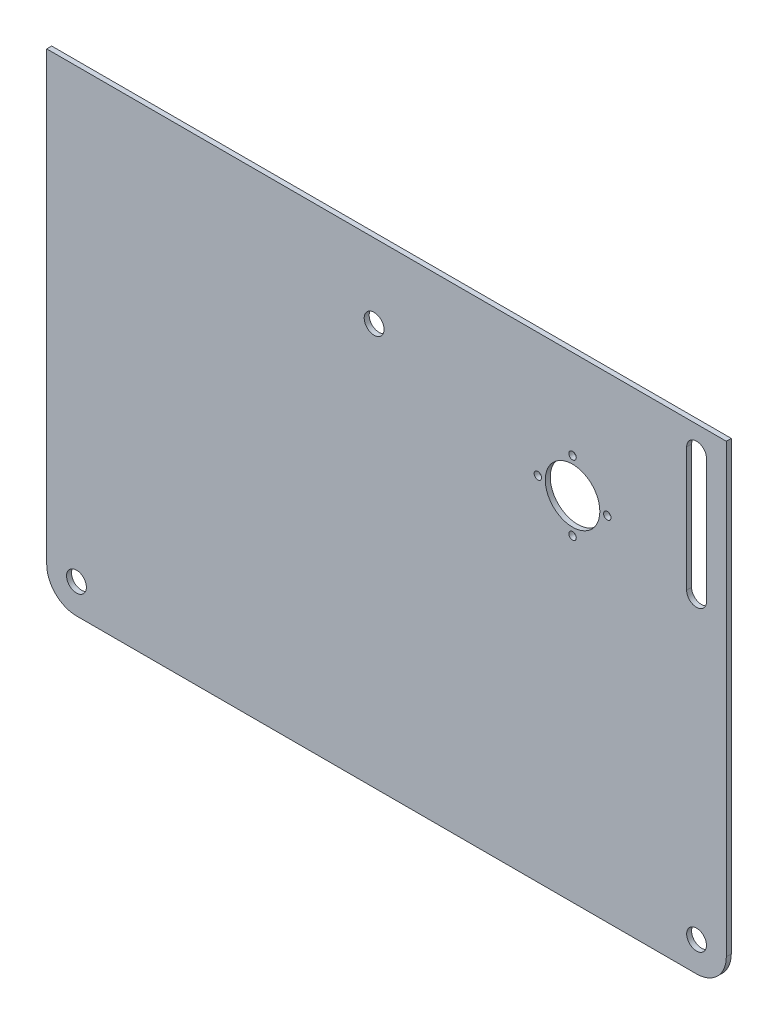
ISO-10303-21;
HEADER;
FILE_DESCRIPTION(('STEP AP214'),'2;1');
FILE_NAME('part.step','',(''),(''),'','','');
FILE_SCHEMA(('AUTOMOTIVE_DESIGN { 1 0 10303 214 1 1 1 1 }'));
ENDSEC;
DATA;
#1=APPLICATION_CONTEXT('core data for automotive mechanical design processes');
#2=APPLICATION_PROTOCOL_DEFINITION('international standard','automotive_design',2000,#1);
#3=PRODUCT_CONTEXT('',#1,'mechanical');
#4=PRODUCT('Part','Part','',(#3));
#5=PRODUCT_RELATED_PRODUCT_CATEGORY('part','',(#4));
#6=PRODUCT_DEFINITION_FORMATION('','',#4);
#7=PRODUCT_DEFINITION_CONTEXT('part definition',#1,'design');
#8=PRODUCT_DEFINITION('design','',#6,#7);
#9=PRODUCT_DEFINITION_SHAPE('','',#8);
#10=(LENGTH_UNIT() NAMED_UNIT(*) SI_UNIT(.MILLI.,.METRE.));
#11=(NAMED_UNIT(*) PLANE_ANGLE_UNIT() SI_UNIT($,.RADIAN.));
#12=(NAMED_UNIT(*) SI_UNIT($,.STERADIAN.) SOLID_ANGLE_UNIT());
#13=UNCERTAINTY_MEASURE_WITH_UNIT(LENGTH_MEASURE(1.E-05),#10,'distance_accuracy_value','');
#14=(GEOMETRIC_REPRESENTATION_CONTEXT(3) GLOBAL_UNCERTAINTY_ASSIGNED_CONTEXT((#13)) GLOBAL_UNIT_ASSIGNED_CONTEXT((#10,
#11,#12)) REPRESENTATION_CONTEXT('',''));
#15=CARTESIAN_POINT('',(0.,0.,0.));
#16=DIRECTION('',(0.,0.,1.));
#17=DIRECTION('',(1.,0.,0.));
#18=AXIS2_PLACEMENT_3D('',#15,#16,#17);
#19=CARTESIAN_POINT('',(0.,-12.,2.));
#20=DIRECTION('',(0.,1.,0.));
#21=DIRECTION('',(0.,0.,1.));
#22=AXIS2_PLACEMENT_3D('',#19,#20,#21);
#23=PLANE('',#22);
#24=DIRECTION('',(1.,0.,0.));
#25=VECTOR('',#24,1.);
#26=CARTESIAN_POINT('',(0.,-12.,0.));
#27=LINE('',#26,#25);
#28=CARTESIAN_POINT('',(-125.,-12.,0.));
#29=VERTEX_POINT('',#28);
#30=CARTESIAN_POINT('',(125.,-12.,0.));
#31=VERTEX_POINT('',#30);
#32=EDGE_CURVE('E212',#29,#31,#27,.T.);
#33=ORIENTED_EDGE('',*,*,#32,.T.);
#34=DIRECTION('',(0.,0.,-1.));
#35=VECTOR('',#34,1.);
#36=CARTESIAN_POINT('',(125.,-12.,2.));
#37=LINE('',#36,#35);
#38=CARTESIAN_POINT('',(125.,-12.,2.));
#39=VERTEX_POINT('',#38);
#40=EDGE_CURVE('E11',#39,#31,#37,.T.);
#41=ORIENTED_EDGE('',*,*,#40,.F.);
#42=DIRECTION('',(1.,0.,0.));
#43=VECTOR('',#42,1.);
#44=CARTESIAN_POINT('',(0.,-12.,2.));
#45=LINE('',#44,#43);
#46=CARTESIAN_POINT('',(-125.,-12.,2.));
#47=VERTEX_POINT('',#46);
#48=EDGE_CURVE('E349',#47,#39,#45,.T.);
#49=ORIENTED_EDGE('',*,*,#48,.F.);
#50=DIRECTION('',(0.,0.,-1.));
#51=VECTOR('',#50,1.);
#52=CARTESIAN_POINT('',(-125.,-12.,2.));
#53=LINE('',#52,#51);
#54=EDGE_CURVE('E65',#47,#29,#53,.T.);
#55=ORIENTED_EDGE('',*,*,#54,.T.);
#56=EDGE_LOOP('',(#33,#41,#49,#55));
#57=FACE_BOUND('',#56,.T.);
#58=ADVANCED_FACE('F45',(#57),#23,.F.);
#59=CARTESIAN_POINT('',(125.,0.,2.));
#60=DIRECTION('',(0.,0.,-1.));
#61=DIRECTION('',(-1.,0.,0.));
#62=AXIS2_PLACEMENT_3D('',#59,#60,#61);
#63=CYLINDRICAL_SURFACE('',#62,12.0000000000001);
#64=CARTESIAN_POINT('',(125.,0.,0.));
#65=DIRECTION('',(0.,0.,1.));
#66=DIRECTION('',(1.,0.,0.));
#67=AXIS2_PLACEMENT_3D('',#64,#65,#66);
#68=CIRCLE('',#67,12.0000000000001);
#69=CARTESIAN_POINT('',(137.,0.,0.));
#70=VERTEX_POINT('',#69);
#71=EDGE_CURVE('E215',#31,#70,#68,.T.);
#72=ORIENTED_EDGE('',*,*,#71,.T.);
#73=DIRECTION('',(0.,0.,-1.));
#74=VECTOR('',#73,1.);
#75=CARTESIAN_POINT('',(137.,0.,2.));
#76=LINE('',#75,#74);
#77=CARTESIAN_POINT('',(137.,0.,2.));
#78=VERTEX_POINT('',#77);
#79=EDGE_CURVE('E56',#78,#70,#76,.T.);
#80=ORIENTED_EDGE('',*,*,#79,.F.);
#81=CARTESIAN_POINT('',(125.,0.,2.));
#82=DIRECTION('',(0.,0.,1.));
#83=DIRECTION('',(1.,0.,0.));
#84=AXIS2_PLACEMENT_3D('',#81,#82,#83);
#85=CIRCLE('',#84,12.0000000000001);
#86=EDGE_CURVE('E352',#39,#78,#85,.T.);
#87=ORIENTED_EDGE('',*,*,#86,.F.);
#88=ORIENTED_EDGE('',*,*,#40,.T.);
#89=EDGE_LOOP('',(#72,#80,#87,#88));
#90=FACE_BOUND('',#89,.T.);
#91=ADVANCED_FACE('F279',(#90),#63,.T.);
#92=CARTESIAN_POINT('',(137.,0.,2.));
#93=DIRECTION('',(-1.,0.,0.));
#94=DIRECTION('',(0.,0.,1.));
#95=AXIS2_PLACEMENT_3D('',#92,#93,#94);
#96=PLANE('',#95);
#97=DIRECTION('',(0.,1.,0.));
#98=VECTOR('',#97,1.);
#99=CARTESIAN_POINT('',(137.,0.,0.));
#100=LINE('',#99,#98);
#101=CARTESIAN_POINT('',(137.,180.,0.));
#102=VERTEX_POINT('',#101);
#103=EDGE_CURVE('E218',#70,#102,#100,.T.);
#104=ORIENTED_EDGE('',*,*,#103,.T.);
#105=DIRECTION('',(0.,0.,-1.));
#106=VECTOR('',#105,1.);
#107=CARTESIAN_POINT('',(137.,180.,2.));
#108=LINE('',#107,#106);
#109=CARTESIAN_POINT('',(137.,180.,2.));
#110=VERTEX_POINT('',#109);
#111=EDGE_CURVE('E153',#110,#102,#108,.T.);
#112=ORIENTED_EDGE('',*,*,#111,.F.);
#113=DIRECTION('',(0.,1.,0.));
#114=VECTOR('',#113,1.);
#115=CARTESIAN_POINT('',(137.,0.,2.));
#116=LINE('',#115,#114);
#117=EDGE_CURVE('E139',#78,#110,#116,.T.);
#118=ORIENTED_EDGE('',*,*,#117,.F.);
#119=ORIENTED_EDGE('',*,*,#79,.T.);
#120=EDGE_LOOP('',(#104,#112,#118,#119));
#121=FACE_BOUND('',#120,.T.);
#122=ADVANCED_FACE('F284',(#121),#96,.F.);
#123=CARTESIAN_POINT('',(0.,180.,2.));
#124=DIRECTION('',(0.,-1.,0.));
#125=DIRECTION('',(1.,0.,0.));
#126=AXIS2_PLACEMENT_3D('',#123,#124,#125);
#127=PLANE('',#126);
#128=DIRECTION('',(-1.,0.,0.));
#129=VECTOR('',#128,1.);
#130=CARTESIAN_POINT('',(0.,180.,0.));
#131=LINE('',#130,#129);
#132=CARTESIAN_POINT('',(-137.,180.,0.));
#133=VERTEX_POINT('',#132);
#134=EDGE_CURVE('E149',#102,#133,#131,.T.);
#135=ORIENTED_EDGE('',*,*,#134,.T.);
#136=DIRECTION('',(0.,0.,-1.));
#137=VECTOR('',#136,1.);
#138=CARTESIAN_POINT('',(-137.,180.,2.));
#139=LINE('',#138,#137);
#140=CARTESIAN_POINT('',(-137.,180.,2.));
#141=VERTEX_POINT('',#140);
#142=EDGE_CURVE('E146',#141,#133,#139,.T.);
#143=ORIENTED_EDGE('',*,*,#142,.F.);
#144=DIRECTION('',(-1.,0.,0.));
#145=VECTOR('',#144,1.);
#146=CARTESIAN_POINT('',(0.,180.,2.));
#147=LINE('',#146,#145);
#148=EDGE_CURVE('E131',#110,#141,#147,.T.);
#149=ORIENTED_EDGE('',*,*,#148,.F.);
#150=ORIENTED_EDGE('',*,*,#111,.T.);
#151=EDGE_LOOP('',(#135,#143,#149,#150));
#152=FACE_BOUND('',#151,.T.);
#153=ADVANCED_FACE('F147',(#152),#127,.F.);
#154=CARTESIAN_POINT('',(-137.,0.,2.));
#155=DIRECTION('',(1.,0.,0.));
#156=DIRECTION('',(0.,1.,0.));
#157=AXIS2_PLACEMENT_3D('',#154,#155,#156);
#158=PLANE('',#157);
#159=DIRECTION('',(0.,-1.,0.));
#160=VECTOR('',#159,1.);
#161=CARTESIAN_POINT('',(-137.,0.,0.));
#162=LINE('',#161,#160);
#163=CARTESIAN_POINT('',(-137.,0.,0.));
#164=VERTEX_POINT('',#163);
#165=EDGE_CURVE('E223',#133,#164,#162,.T.);
#166=ORIENTED_EDGE('',*,*,#165,.T.);
#167=DIRECTION('',(0.,0.,-1.));
#168=VECTOR('',#167,1.);
#169=CARTESIAN_POINT('',(-137.,0.,2.));
#170=LINE('',#169,#168);
#171=CARTESIAN_POINT('',(-137.,0.,2.));
#172=VERTEX_POINT('',#171);
#173=EDGE_CURVE('E98',#172,#164,#170,.T.);
#174=ORIENTED_EDGE('',*,*,#173,.F.);
#175=DIRECTION('',(0.,-1.,0.));
#176=VECTOR('',#175,1.);
#177=CARTESIAN_POINT('',(-137.,0.,2.));
#178=LINE('',#177,#176);
#179=EDGE_CURVE('E137',#141,#172,#178,.T.);
#180=ORIENTED_EDGE('',*,*,#179,.F.);
#181=ORIENTED_EDGE('',*,*,#142,.T.);
#182=EDGE_LOOP('',(#166,#174,#180,#181));
#183=FACE_BOUND('',#182,.T.);
#184=ADVANCED_FACE('F155',(#183),#158,.F.);
#185=CARTESIAN_POINT('',(125.,120.,2.));
#186=DIRECTION('',(0.,0.,-1.));
#187=DIRECTION('',(-1.,0.,0.));
#188=AXIS2_PLACEMENT_3D('',#185,#186,#187);
#189=CYLINDRICAL_SURFACE('',#188,3.99999999999999);
#190=CARTESIAN_POINT('',(125.,120.,0.));
#191=DIRECTION('',(0.,0.,1.));
#192=DIRECTION('',(1.,0.,0.));
#193=AXIS2_PLACEMENT_3D('',#190,#191,#192);
#194=CIRCLE('',#193,3.99999999999999);
#195=CARTESIAN_POINT('',(121.,120.,0.));
#196=VERTEX_POINT('',#195);
#197=CARTESIAN_POINT('',(129.,120.,0.));
#198=VERTEX_POINT('',#197);
#199=EDGE_CURVE('E196',#196,#198,#194,.T.);
#200=ORIENTED_EDGE('',*,*,#199,.F.);
#201=DIRECTION('',(0.,0.,-1.));
#202=VECTOR('',#201,1.);
#203=CARTESIAN_POINT('',(121.,120.,2.));
#204=LINE('',#203,#202);
#205=CARTESIAN_POINT('',(121.,120.,2.));
#206=VERTEX_POINT('',#205);
#207=EDGE_CURVE('E49',#206,#196,#204,.T.);
#208=ORIENTED_EDGE('',*,*,#207,.F.);
#209=CARTESIAN_POINT('',(125.,120.,2.));
#210=DIRECTION('',(0.,0.,1.));
#211=DIRECTION('',(1.,0.,0.));
#212=AXIS2_PLACEMENT_3D('',#209,#210,#211);
#213=CIRCLE('',#212,3.99999999999999);
#214=CARTESIAN_POINT('',(129.,120.,2.));
#215=VERTEX_POINT('',#214);
#216=EDGE_CURVE('E261',#206,#215,#213,.T.);
#217=ORIENTED_EDGE('',*,*,#216,.T.);
#218=DIRECTION('',(0.,0.,-1.));
#219=VECTOR('',#218,1.);
#220=CARTESIAN_POINT('',(129.,120.,2.));
#221=LINE('',#220,#219);
#222=EDGE_CURVE('E160',#215,#198,#221,.T.);
#223=ORIENTED_EDGE('',*,*,#222,.T.);
#224=EDGE_LOOP('',(#200,#208,#217,#223));
#225=FACE_BOUND('',#224,.T.);
#226=ADVANCED_FACE('F260',(#225),#189,.F.);
#227=CARTESIAN_POINT('',(121.,0.,2.));
#228=DIRECTION('',(-1.,0.,0.));
#229=DIRECTION('',(0.,0.,1.));
#230=AXIS2_PLACEMENT_3D('',#227,#228,#229);
#231=PLANE('',#230);
#232=DIRECTION('',(0.,1.,0.));
#233=VECTOR('',#232,1.);
#234=CARTESIAN_POINT('',(121.,0.,0.));
#235=LINE('',#234,#233);
#236=CARTESIAN_POINT('',(121.,170.,0.));
#237=VERTEX_POINT('',#236);
#238=EDGE_CURVE('E200',#196,#237,#235,.T.);
#239=ORIENTED_EDGE('',*,*,#238,.T.);
#240=DIRECTION('',(0.,0.,-1.));
#241=VECTOR('',#240,1.);
#242=CARTESIAN_POINT('',(121.,170.,2.));
#243=LINE('',#242,#241);
#244=CARTESIAN_POINT('',(121.,170.,2.));
#245=VERTEX_POINT('',#244);
#246=EDGE_CURVE('E244',#245,#237,#243,.T.);
#247=ORIENTED_EDGE('',*,*,#246,.F.);
#248=DIRECTION('',(0.,1.,0.));
#249=VECTOR('',#248,1.);
#250=CARTESIAN_POINT('',(121.,0.,2.));
#251=LINE('',#250,#249);
#252=EDGE_CURVE('E254',#206,#245,#251,.T.);
#253=ORIENTED_EDGE('',*,*,#252,.F.);
#254=ORIENTED_EDGE('',*,*,#207,.T.);
#255=EDGE_LOOP('',(#239,#247,#253,#254));
#256=FACE_BOUND('',#255,.T.);
#257=ADVANCED_FACE('F253',(#256),#231,.F.);
#258=CARTESIAN_POINT('',(125.,170.,2.));
#259=DIRECTION('',(0.,0.,-1.));
#260=DIRECTION('',(-1.,0.,0.));
#261=AXIS2_PLACEMENT_3D('',#258,#259,#260);
#262=CYLINDRICAL_SURFACE('',#261,3.99999999999995);
#263=CARTESIAN_POINT('',(125.,170.,0.));
#264=DIRECTION('',(0.,0.,1.));
#265=DIRECTION('',(1.,0.,0.));
#266=AXIS2_PLACEMENT_3D('',#263,#264,#265);
#267=CIRCLE('',#266,3.99999999999995);
#268=CARTESIAN_POINT('',(129.,170.,0.));
#269=VERTEX_POINT('',#268);
#270=EDGE_CURVE('E204',#269,#237,#267,.T.);
#271=ORIENTED_EDGE('',*,*,#270,.F.);
#272=DIRECTION('',(0.,0.,-1.));
#273=VECTOR('',#272,1.);
#274=CARTESIAN_POINT('',(129.,170.,2.));
#275=LINE('',#274,#273);
#276=CARTESIAN_POINT('',(129.,170.,2.));
#277=VERTEX_POINT('',#276);
#278=EDGE_CURVE('E242',#277,#269,#275,.T.);
#279=ORIENTED_EDGE('',*,*,#278,.F.);
#280=CARTESIAN_POINT('',(125.,170.,2.));
#281=DIRECTION('',(0.,0.,1.));
#282=DIRECTION('',(1.,0.,0.));
#283=AXIS2_PLACEMENT_3D('',#280,#281,#282);
#284=CIRCLE('',#283,3.99999999999995);
#285=EDGE_CURVE('E340',#277,#245,#284,.T.);
#286=ORIENTED_EDGE('',*,*,#285,.T.);
#287=ORIENTED_EDGE('',*,*,#246,.T.);
#288=EDGE_LOOP('',(#271,#279,#286,#287));
#289=FACE_BOUND('',#288,.T.);
#290=ADVANCED_FACE('F268',(#289),#262,.F.);
#291=CARTESIAN_POINT('',(129.,0.,2.));
#292=DIRECTION('',(-1.,0.,0.));
#293=DIRECTION('',(0.,-1.,0.));
#294=AXIS2_PLACEMENT_3D('',#291,#292,#293);
#295=PLANE('',#294);
#296=DIRECTION('',(0.,1.,0.));
#297=VECTOR('',#296,1.);
#298=CARTESIAN_POINT('',(129.,0.,0.));
#299=LINE('',#298,#297);
#300=EDGE_CURVE('E208',#198,#269,#299,.T.);
#301=ORIENTED_EDGE('',*,*,#300,.F.);
#302=ORIENTED_EDGE('',*,*,#222,.F.);
#303=DIRECTION('',(0.,1.,0.));
#304=VECTOR('',#303,1.);
#305=CARTESIAN_POINT('',(129.,0.,2.));
#306=LINE('',#305,#304);
#307=EDGE_CURVE('E266',#215,#277,#306,.T.);
#308=ORIENTED_EDGE('',*,*,#307,.T.);
#309=ORIENTED_EDGE('',*,*,#278,.T.);
#310=EDGE_LOOP('',(#301,#302,#308,#309));
#311=FACE_BOUND('',#310,.T.);
#312=ADVANCED_FACE('F265',(#311),#295,.T.);
#313=CARTESIAN_POINT('',(-5.00000000000002,150.,2.));
#314=DIRECTION('',(0.,0.,-1.));
#315=DIRECTION('',(-1.,0.,0.));
#316=AXIS2_PLACEMENT_3D('',#313,#314,#315);
#317=CYLINDRICAL_SURFACE('',#316,4.00000000000001);
#318=CARTESIAN_POINT('',(-5.00000000000002,150.,2.));
#319=DIRECTION('',(0.,0.,1.));
#320=DIRECTION('',(1.,0.,0.));
#321=AXIS2_PLACEMENT_3D('',#318,#319,#320);
#322=CIRCLE('',#321,4.00000000000001);
#323=CARTESIAN_POINT('',(-1.00000000000001,150.,2.));
#324=VERTEX_POINT('',#323);
#325=EDGE_CURVE('E335',#324,#324,#322,.T.);
#326=ORIENTED_EDGE('',*,*,#325,.T.);
#327=EDGE_LOOP('',(#326));
#328=FACE_BOUND('',#327,.T.);
#329=CARTESIAN_POINT('',(-5.00000000000002,150.,0.));
#330=DIRECTION('',(0.,0.,1.));
#331=DIRECTION('',(1.,0.,0.));
#332=AXIS2_PLACEMENT_3D('',#329,#330,#331);
#333=CIRCLE('',#332,4.00000000000001);
#334=CARTESIAN_POINT('',(-1.00000000000001,150.,0.));
#335=VERTEX_POINT('',#334);
#336=EDGE_CURVE('E192',#335,#335,#333,.T.);
#337=ORIENTED_EDGE('',*,*,#336,.F.);
#338=EDGE_LOOP('',(#337));
#339=FACE_BOUND('',#338,.T.);
#340=ADVANCED_FACE('F275',(#328,#339),#317,.F.);
#341=CARTESIAN_POINT('',(75.,130.,2.));
#342=DIRECTION('',(0.,0.,-1.));
#343=DIRECTION('',(-1.,0.,0.));
#344=AXIS2_PLACEMENT_3D('',#341,#342,#343);
#345=CYLINDRICAL_SURFACE('',#344,11.);
#346=CARTESIAN_POINT('',(75.,130.,2.));
#347=DIRECTION('',(0.,0.,1.));
#348=DIRECTION('',(1.,0.,0.));
#349=AXIS2_PLACEMENT_3D('',#346,#347,#348);
#350=CIRCLE('',#349,11.);
#351=CARTESIAN_POINT('',(86.,130.,2.));
#352=VERTEX_POINT('',#351);
#353=EDGE_CURVE('E331',#352,#352,#350,.T.);
#354=ORIENTED_EDGE('',*,*,#353,.T.);
#355=EDGE_LOOP('',(#354));
#356=FACE_BOUND('',#355,.T.);
#357=CARTESIAN_POINT('',(75.,130.,0.));
#358=DIRECTION('',(0.,0.,1.));
#359=DIRECTION('',(1.,0.,0.));
#360=AXIS2_PLACEMENT_3D('',#357,#358,#359);
#361=CIRCLE('',#360,11.);
#362=CARTESIAN_POINT('',(86.,130.,0.));
#363=VERTEX_POINT('',#362);
#364=EDGE_CURVE('E188',#363,#363,#361,.T.);
#365=ORIENTED_EDGE('',*,*,#364,.F.);
#366=EDGE_LOOP('',(#365));
#367=FACE_BOUND('',#366,.T.);
#368=ADVANCED_FACE('F392',(#356,#367),#345,.F.);
#369=CARTESIAN_POINT('',(125.,0.,2.));
#370=DIRECTION('',(0.,0.,-1.));
#371=DIRECTION('',(-1.,0.,0.));
#372=AXIS2_PLACEMENT_3D('',#369,#370,#371);
#373=CYLINDRICAL_SURFACE('',#372,3.99999999999999);
#374=CARTESIAN_POINT('',(125.,0.,2.));
#375=DIRECTION('',(0.,0.,1.));
#376=DIRECTION('',(1.,0.,0.));
#377=AXIS2_PLACEMENT_3D('',#374,#375,#376);
#378=CIRCLE('',#377,3.99999999999999);
#379=CARTESIAN_POINT('',(129.,0.,2.));
#380=VERTEX_POINT('',#379);
#381=EDGE_CURVE('E327',#380,#380,#378,.T.);
#382=ORIENTED_EDGE('',*,*,#381,.T.);
#383=EDGE_LOOP('',(#382));
#384=FACE_BOUND('',#383,.T.);
#385=CARTESIAN_POINT('',(125.,0.,0.));
#386=DIRECTION('',(0.,0.,1.));
#387=DIRECTION('',(1.,0.,0.));
#388=AXIS2_PLACEMENT_3D('',#385,#386,#387);
#389=CIRCLE('',#388,3.99999999999999);
#390=CARTESIAN_POINT('',(129.,0.,0.));
#391=VERTEX_POINT('',#390);
#392=EDGE_CURVE('E184',#391,#391,#389,.T.);
#393=ORIENTED_EDGE('',*,*,#392,.F.);
#394=EDGE_LOOP('',(#393));
#395=FACE_BOUND('',#394,.T.);
#396=ADVANCED_FACE('F398',(#384,#395),#373,.F.);
#397=CARTESIAN_POINT('',(-125.,0.,2.));
#398=DIRECTION('',(0.,0.,-1.));
#399=DIRECTION('',(-1.,0.,0.));
#400=AXIS2_PLACEMENT_3D('',#397,#398,#399);
#401=CYLINDRICAL_SURFACE('',#400,4.00000000000001);
#402=CARTESIAN_POINT('',(-125.,0.,2.));
#403=DIRECTION('',(0.,0.,1.));
#404=DIRECTION('',(1.,0.,0.));
#405=AXIS2_PLACEMENT_3D('',#402,#403,#404);
#406=CIRCLE('',#405,4.00000000000001);
#407=CARTESIAN_POINT('',(-121.,0.,2.));
#408=VERTEX_POINT('',#407);
#409=EDGE_CURVE('E323',#408,#408,#406,.T.);
#410=ORIENTED_EDGE('',*,*,#409,.T.);
#411=EDGE_LOOP('',(#410));
#412=FACE_BOUND('',#411,.T.);
#413=CARTESIAN_POINT('',(-125.,0.,0.));
#414=DIRECTION('',(0.,0.,1.));
#415=DIRECTION('',(1.,0.,0.));
#416=AXIS2_PLACEMENT_3D('',#413,#414,#415);
#417=CIRCLE('',#416,4.00000000000001);
#418=CARTESIAN_POINT('',(-121.,0.,0.));
#419=VERTEX_POINT('',#418);
#420=EDGE_CURVE('E180',#419,#419,#417,.T.);
#421=ORIENTED_EDGE('',*,*,#420,.F.);
#422=EDGE_LOOP('',(#421));
#423=FACE_BOUND('',#422,.T.);
#424=ADVANCED_FACE('F405',(#412,#423),#401,.F.);
#425=CARTESIAN_POINT('',(75.,144.,2.));
#426=DIRECTION('',(0.,0.,-1.));
#427=DIRECTION('',(-1.,0.,0.));
#428=AXIS2_PLACEMENT_3D('',#425,#426,#427);
#429=CYLINDRICAL_SURFACE('',#428,1.5);
#430=CARTESIAN_POINT('',(75.,144.,2.));
#431=DIRECTION('',(0.,0.,1.));
#432=DIRECTION('',(1.,0.,0.));
#433=AXIS2_PLACEMENT_3D('',#430,#431,#432);
#434=CIRCLE('',#433,1.5);
#435=CARTESIAN_POINT('',(76.5,144.,2.));
#436=VERTEX_POINT('',#435);
#437=EDGE_CURVE('E319',#436,#436,#434,.T.);
#438=ORIENTED_EDGE('',*,*,#437,.T.);
#439=EDGE_LOOP('',(#438));
#440=FACE_BOUND('',#439,.T.);
#441=CARTESIAN_POINT('',(75.,144.,0.));
#442=DIRECTION('',(0.,0.,1.));
#443=DIRECTION('',(1.,0.,0.));
#444=AXIS2_PLACEMENT_3D('',#441,#442,#443);
#445=CIRCLE('',#444,1.5);
#446=CARTESIAN_POINT('',(76.5,144.,0.));
#447=VERTEX_POINT('',#446);
#448=EDGE_CURVE('E176',#447,#447,#445,.T.);
#449=ORIENTED_EDGE('',*,*,#448,.F.);
#450=EDGE_LOOP('',(#449));
#451=FACE_BOUND('',#450,.T.);
#452=ADVANCED_FACE('F409',(#440,#451),#429,.F.);
#453=CARTESIAN_POINT('',(89.,130.,2.));
#454=DIRECTION('',(0.,0.,-1.));
#455=DIRECTION('',(-1.,0.,0.));
#456=AXIS2_PLACEMENT_3D('',#453,#454,#455);
#457=CYLINDRICAL_SURFACE('',#456,1.49999999999998);
#458=CARTESIAN_POINT('',(89.,130.,2.));
#459=DIRECTION('',(0.,0.,1.));
#460=DIRECTION('',(1.,0.,0.));
#461=AXIS2_PLACEMENT_3D('',#458,#459,#460);
#462=CIRCLE('',#461,1.49999999999998);
#463=CARTESIAN_POINT('',(90.5,130.,2.));
#464=VERTEX_POINT('',#463);
#465=EDGE_CURVE('E315',#464,#464,#462,.T.);
#466=ORIENTED_EDGE('',*,*,#465,.T.);
#467=EDGE_LOOP('',(#466));
#468=FACE_BOUND('',#467,.T.);
#469=CARTESIAN_POINT('',(89.,130.,0.));
#470=DIRECTION('',(0.,0.,1.));
#471=DIRECTION('',(1.,0.,0.));
#472=AXIS2_PLACEMENT_3D('',#469,#470,#471);
#473=CIRCLE('',#472,1.49999999999998);
#474=CARTESIAN_POINT('',(90.5,130.,0.));
#475=VERTEX_POINT('',#474);
#476=EDGE_CURVE('E172',#475,#475,#473,.T.);
#477=ORIENTED_EDGE('',*,*,#476,.F.);
#478=EDGE_LOOP('',(#477));
#479=FACE_BOUND('',#478,.T.);
#480=ADVANCED_FACE('F413',(#468,#479),#457,.F.);
#481=CARTESIAN_POINT('',(75.,116.,2.));
#482=DIRECTION('',(0.,0.,-1.));
#483=DIRECTION('',(-1.,0.,0.));
#484=AXIS2_PLACEMENT_3D('',#481,#482,#483);
#485=CYLINDRICAL_SURFACE('',#484,1.50000000000001);
#486=CARTESIAN_POINT('',(75.,116.,2.));
#487=DIRECTION('',(0.,0.,1.));
#488=DIRECTION('',(1.,0.,0.));
#489=AXIS2_PLACEMENT_3D('',#486,#487,#488);
#490=CIRCLE('',#489,1.50000000000001);
#491=CARTESIAN_POINT('',(76.5,116.,2.));
#492=VERTEX_POINT('',#491);
#493=EDGE_CURVE('E311',#492,#492,#490,.T.);
#494=ORIENTED_EDGE('',*,*,#493,.T.);
#495=EDGE_LOOP('',(#494));
#496=FACE_BOUND('',#495,.T.);
#497=CARTESIAN_POINT('',(75.,116.,0.));
#498=DIRECTION('',(0.,0.,1.));
#499=DIRECTION('',(1.,0.,0.));
#500=AXIS2_PLACEMENT_3D('',#497,#498,#499);
#501=CIRCLE('',#500,1.50000000000001);
#502=CARTESIAN_POINT('',(76.5,116.,0.));
#503=VERTEX_POINT('',#502);
#504=EDGE_CURVE('E168',#503,#503,#501,.T.);
#505=ORIENTED_EDGE('',*,*,#504,.F.);
#506=EDGE_LOOP('',(#505));
#507=FACE_BOUND('',#506,.T.);
#508=ADVANCED_FACE('F374',(#496,#507),#485,.F.);
#509=CARTESIAN_POINT('',(61.,130.,2.));
#510=DIRECTION('',(0.,0.,-1.));
#511=DIRECTION('',(-1.,0.,0.));
#512=AXIS2_PLACEMENT_3D('',#509,#510,#511);
#513=CYLINDRICAL_SURFACE('',#512,1.5);
#514=CARTESIAN_POINT('',(61.,130.,2.));
#515=DIRECTION('',(0.,0.,1.));
#516=DIRECTION('',(1.,0.,0.));
#517=AXIS2_PLACEMENT_3D('',#514,#515,#516);
#518=CIRCLE('',#517,1.5);
#519=CARTESIAN_POINT('',(62.5,130.,2.));
#520=VERTEX_POINT('',#519);
#521=EDGE_CURVE('E230',#520,#520,#518,.T.);
#522=ORIENTED_EDGE('',*,*,#521,.T.);
#523=EDGE_LOOP('',(#522));
#524=FACE_BOUND('',#523,.T.);
#525=CARTESIAN_POINT('',(61.,130.,0.));
#526=DIRECTION('',(0.,0.,1.));
#527=DIRECTION('',(1.,0.,0.));
#528=AXIS2_PLACEMENT_3D('',#525,#526,#527);
#529=CIRCLE('',#528,1.5);
#530=CARTESIAN_POINT('',(62.5,130.,0.));
#531=VERTEX_POINT('',#530);
#532=EDGE_CURVE('E164',#531,#531,#529,.T.);
#533=ORIENTED_EDGE('',*,*,#532,.F.);
#534=EDGE_LOOP('',(#533));
#535=FACE_BOUND('',#534,.T.);
#536=ADVANCED_FACE('F47',(#524,#535),#513,.F.);
#537=CARTESIAN_POINT('',(-125.,0.,2.));
#538=DIRECTION('',(0.,0.,-1.));
#539=DIRECTION('',(-1.,0.,0.));
#540=AXIS2_PLACEMENT_3D('',#537,#538,#539);
#541=CYLINDRICAL_SURFACE('',#540,12.);
#542=CARTESIAN_POINT('',(-125.,0.,0.));
#543=DIRECTION('',(0.,0.,1.));
#544=DIRECTION('',(1.,0.,0.));
#545=AXIS2_PLACEMENT_3D('',#542,#543,#544);
#546=CIRCLE('',#545,12.);
#547=EDGE_CURVE('E226',#29,#164,#546,.F.);
#548=ORIENTED_EDGE('',*,*,#547,.F.);
#549=ORIENTED_EDGE('',*,*,#54,.F.);
#550=CARTESIAN_POINT('',(-125.,0.,2.));
#551=DIRECTION('',(0.,0.,1.));
#552=DIRECTION('',(1.,0.,0.));
#553=AXIS2_PLACEMENT_3D('',#550,#551,#552);
#554=CIRCLE('',#553,12.);
#555=EDGE_CURVE('E157',#47,#172,#554,.F.);
#556=ORIENTED_EDGE('',*,*,#555,.T.);
#557=ORIENTED_EDGE('',*,*,#173,.T.);
#558=EDGE_LOOP('',(#548,#549,#556,#557));
#559=FACE_BOUND('',#558,.T.);
#560=ADVANCED_FACE('F295',(#559),#541,.T.);
#561=CARTESIAN_POINT('',(0.,0.,2.));
#562=DIRECTION('',(0.,0.,1.));
#563=DIRECTION('',(1.,0.,0.));
#564=AXIS2_PLACEMENT_3D('',#561,#562,#563);
#565=PLANE('',#564);
#566=ORIENTED_EDGE('',*,*,#521,.F.);
#567=EDGE_LOOP('',(#566));
#568=FACE_BOUND('',#567,.T.);
#569=ORIENTED_EDGE('',*,*,#493,.F.);
#570=EDGE_LOOP('',(#569));
#571=FACE_BOUND('',#570,.T.);
#572=ORIENTED_EDGE('',*,*,#465,.F.);
#573=EDGE_LOOP('',(#572));
#574=FACE_BOUND('',#573,.T.);
#575=ORIENTED_EDGE('',*,*,#437,.F.);
#576=EDGE_LOOP('',(#575));
#577=FACE_BOUND('',#576,.T.);
#578=ORIENTED_EDGE('',*,*,#409,.F.);
#579=EDGE_LOOP('',(#578));
#580=FACE_BOUND('',#579,.T.);
#581=ORIENTED_EDGE('',*,*,#381,.F.);
#582=EDGE_LOOP('',(#581));
#583=FACE_BOUND('',#582,.T.);
#584=ORIENTED_EDGE('',*,*,#353,.F.);
#585=EDGE_LOOP('',(#584));
#586=FACE_BOUND('',#585,.T.);
#587=ORIENTED_EDGE('',*,*,#325,.F.);
#588=EDGE_LOOP('',(#587));
#589=FACE_BOUND('',#588,.T.);
#590=ORIENTED_EDGE('',*,*,#216,.F.);
#591=ORIENTED_EDGE('',*,*,#252,.T.);
#592=ORIENTED_EDGE('',*,*,#285,.F.);
#593=ORIENTED_EDGE('',*,*,#307,.F.);
#594=EDGE_LOOP('',(#590,#591,#592,#593));
#595=FACE_BOUND('',#594,.T.);
#596=ORIENTED_EDGE('',*,*,#48,.T.);
#597=ORIENTED_EDGE('',*,*,#86,.T.);
#598=ORIENTED_EDGE('',*,*,#117,.T.);
#599=ORIENTED_EDGE('',*,*,#148,.T.);
#600=ORIENTED_EDGE('',*,*,#179,.T.);
#601=ORIENTED_EDGE('',*,*,#555,.F.);
#602=EDGE_LOOP('',(#596,#597,#598,#599,#600,#601));
#603=FACE_BOUND('',#602,.T.);
#604=ADVANCED_FACE('F134',(#568,#571,#574,#577,#580,#583,#586,#589,#595,#603),#565,.T.);
#605=CARTESIAN_POINT('',(0.,0.,0.));
#606=DIRECTION('',(0.,0.,1.));
#607=DIRECTION('',(1.,0.,0.));
#608=AXIS2_PLACEMENT_3D('',#605,#606,#607);
#609=PLANE('',#608);
#610=ORIENTED_EDGE('',*,*,#532,.T.);
#611=EDGE_LOOP('',(#610));
#612=FACE_BOUND('',#611,.T.);
#613=ORIENTED_EDGE('',*,*,#504,.T.);
#614=EDGE_LOOP('',(#613));
#615=FACE_BOUND('',#614,.T.);
#616=ORIENTED_EDGE('',*,*,#476,.T.);
#617=EDGE_LOOP('',(#616));
#618=FACE_BOUND('',#617,.T.);
#619=ORIENTED_EDGE('',*,*,#448,.T.);
#620=EDGE_LOOP('',(#619));
#621=FACE_BOUND('',#620,.T.);
#622=ORIENTED_EDGE('',*,*,#420,.T.);
#623=EDGE_LOOP('',(#622));
#624=FACE_BOUND('',#623,.T.);
#625=ORIENTED_EDGE('',*,*,#392,.T.);
#626=EDGE_LOOP('',(#625));
#627=FACE_BOUND('',#626,.T.);
#628=ORIENTED_EDGE('',*,*,#364,.T.);
#629=EDGE_LOOP('',(#628));
#630=FACE_BOUND('',#629,.T.);
#631=ORIENTED_EDGE('',*,*,#336,.T.);
#632=EDGE_LOOP('',(#631));
#633=FACE_BOUND('',#632,.T.);
#634=ORIENTED_EDGE('',*,*,#199,.T.);
#635=ORIENTED_EDGE('',*,*,#300,.T.);
#636=ORIENTED_EDGE('',*,*,#270,.T.);
#637=ORIENTED_EDGE('',*,*,#238,.F.);
#638=EDGE_LOOP('',(#634,#635,#636,#637));
#639=FACE_BOUND('',#638,.T.);
#640=ORIENTED_EDGE('',*,*,#32,.F.);
#641=ORIENTED_EDGE('',*,*,#547,.T.);
#642=ORIENTED_EDGE('',*,*,#165,.F.);
#643=ORIENTED_EDGE('',*,*,#134,.F.);
#644=ORIENTED_EDGE('',*,*,#103,.F.);
#645=ORIENTED_EDGE('',*,*,#71,.F.);
#646=EDGE_LOOP('',(#640,#641,#642,#643,#644,#645));
#647=FACE_BOUND('',#646,.T.);
#648=ADVANCED_FACE('F257',(#612,#615,#618,#621,#624,#627,#630,#633,#639,#647),#609,.F.);
#649=CLOSED_SHELL('',(#58,#91,#122,#153,#184,#226,#257,#290,#312,#340,#368,#396,#424,#452,#480,
#508,#536,#560,#604,#648));
#650=MANIFOLD_SOLID_BREP('B2',#649);
#651=ADVANCED_BREP_SHAPE_REPRESENTATION('',(#18,#650),#14);
#652=SHAPE_DEFINITION_REPRESENTATION(#9,#651);
ENDSEC;
END-ISO-10303-21;
